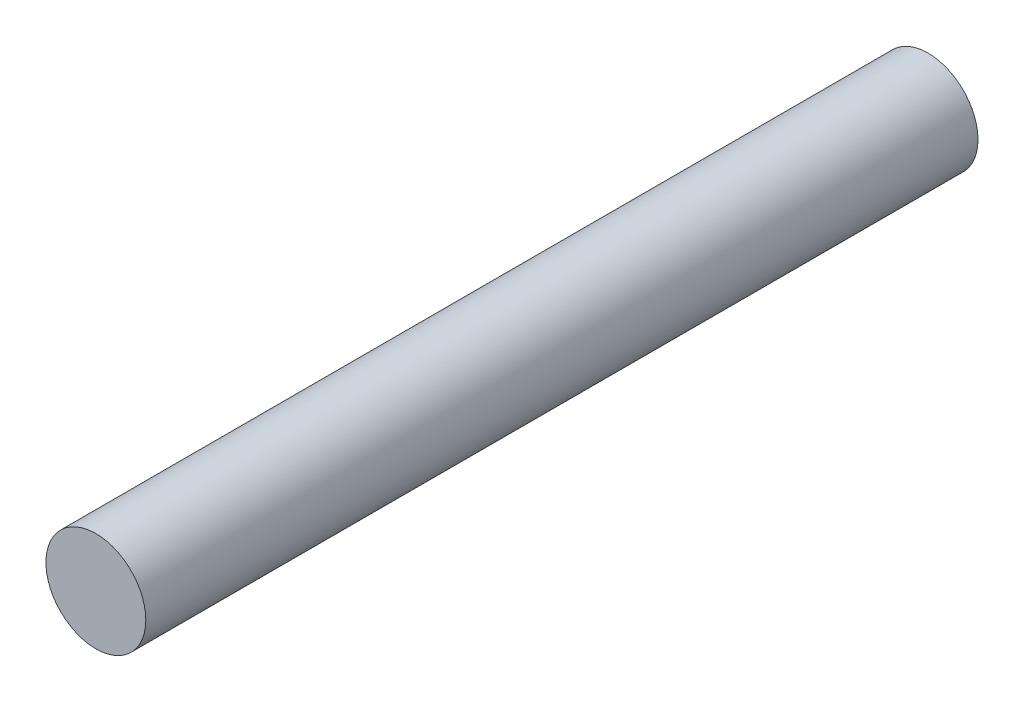
ISO-10303-21;
HEADER;
FILE_DESCRIPTION(('STEP AP214'),'2;1');
FILE_NAME('part.step','',(''),(''),'','','');
FILE_SCHEMA(('AUTOMOTIVE_DESIGN { 1 0 10303 214 1 1 1 1 }'));
ENDSEC;
DATA;
#1=APPLICATION_CONTEXT('core data for automotive mechanical design processes');
#2=APPLICATION_PROTOCOL_DEFINITION('international standard','automotive_design',2000,#1);
#3=PRODUCT_CONTEXT('',#1,'mechanical');
#4=PRODUCT('Part','Part','',(#3));
#5=PRODUCT_RELATED_PRODUCT_CATEGORY('part','',(#4));
#6=PRODUCT_DEFINITION_FORMATION('','',#4);
#7=PRODUCT_DEFINITION_CONTEXT('part definition',#1,'design');
#8=PRODUCT_DEFINITION('design','',#6,#7);
#9=PRODUCT_DEFINITION_SHAPE('','',#8);
#10=(LENGTH_UNIT() NAMED_UNIT(*) SI_UNIT(.MILLI.,.METRE.));
#11=(NAMED_UNIT(*) PLANE_ANGLE_UNIT() SI_UNIT($,.RADIAN.));
#12=(NAMED_UNIT(*) SI_UNIT($,.STERADIAN.) SOLID_ANGLE_UNIT());
#13=UNCERTAINTY_MEASURE_WITH_UNIT(LENGTH_MEASURE(1.E-05),#10,'distance_accuracy_value','');
#14=(GEOMETRIC_REPRESENTATION_CONTEXT(3) GLOBAL_UNCERTAINTY_ASSIGNED_CONTEXT((#13)) GLOBAL_UNIT_ASSIGNED_CONTEXT((#10,
#11,#12)) REPRESENTATION_CONTEXT('',''));
#15=CARTESIAN_POINT('',(0.,0.,0.));
#16=DIRECTION('',(0.,0.,1.));
#17=DIRECTION('',(1.,0.,0.));
#18=AXIS2_PLACEMENT_3D('',#15,#16,#17);
#19=CARTESIAN_POINT('',(0.,0.,12.5));
#20=DIRECTION('',(0.,0.,-1.));
#21=DIRECTION('',(-1.,0.,0.));
#22=AXIS2_PLACEMENT_3D('',#19,#20,#21);
#23=CYLINDRICAL_SURFACE('',#22,1.5);
#24=CARTESIAN_POINT('',(0.,0.,12.5));
#25=DIRECTION('',(0.,0.,1.));
#26=DIRECTION('',(1.,0.,0.));
#27=AXIS2_PLACEMENT_3D('',#24,#25,#26);
#28=CIRCLE('',#27,1.5);
#29=CARTESIAN_POINT('',(1.5,0.,12.5));
#30=VERTEX_POINT('',#29);
#31=EDGE_CURVE('E10',#30,#30,#28,.T.);
#32=ORIENTED_EDGE('',*,*,#31,.F.);
#33=EDGE_LOOP('',(#32));
#34=FACE_BOUND('',#33,.T.);
#35=CARTESIAN_POINT('',(0.,0.,-12.5));
#36=DIRECTION('',(0.,0.,1.));
#37=DIRECTION('',(1.,0.,0.));
#38=AXIS2_PLACEMENT_3D('',#35,#36,#37);
#39=CIRCLE('',#38,1.5);
#40=CARTESIAN_POINT('',(1.5,0.,-12.5));
#41=VERTEX_POINT('',#40);
#42=EDGE_CURVE('E35',#41,#41,#39,.T.);
#43=ORIENTED_EDGE('',*,*,#42,.T.);
#44=EDGE_LOOP('',(#43));
#45=FACE_BOUND('',#44,.T.);
#46=ADVANCED_FACE('F32',(#34,#45),#23,.T.);
#47=CARTESIAN_POINT('',(0.,0.,12.5));
#48=DIRECTION('',(0.,0.,1.));
#49=DIRECTION('',(1.,0.,0.));
#50=AXIS2_PLACEMENT_3D('',#47,#48,#49);
#51=PLANE('',#50);
#52=ORIENTED_EDGE('',*,*,#31,.T.);
#53=EDGE_LOOP('',(#52));
#54=FACE_BOUND('',#53,.T.);
#55=ADVANCED_FACE('F47',(#54),#51,.T.);
#56=CARTESIAN_POINT('',(0.,0.,-12.5));
#57=DIRECTION('',(0.,0.,1.));
#58=DIRECTION('',(1.,0.,0.));
#59=AXIS2_PLACEMENT_3D('',#56,#57,#58);
#60=PLANE('',#59);
#61=ORIENTED_EDGE('',*,*,#42,.F.);
#62=EDGE_LOOP('',(#61));
#63=FACE_BOUND('',#62,.T.);
#64=ADVANCED_FACE('F45',(#63),#60,.F.);
#65=CLOSED_SHELL('',(#46,#55,#64));
#66=MANIFOLD_SOLID_BREP('B2',#65);
#67=ADVANCED_BREP_SHAPE_REPRESENTATION('',(#18,#66),#14);
#68=SHAPE_DEFINITION_REPRESENTATION(#9,#67);
ENDSEC;
END-ISO-10303-21;
